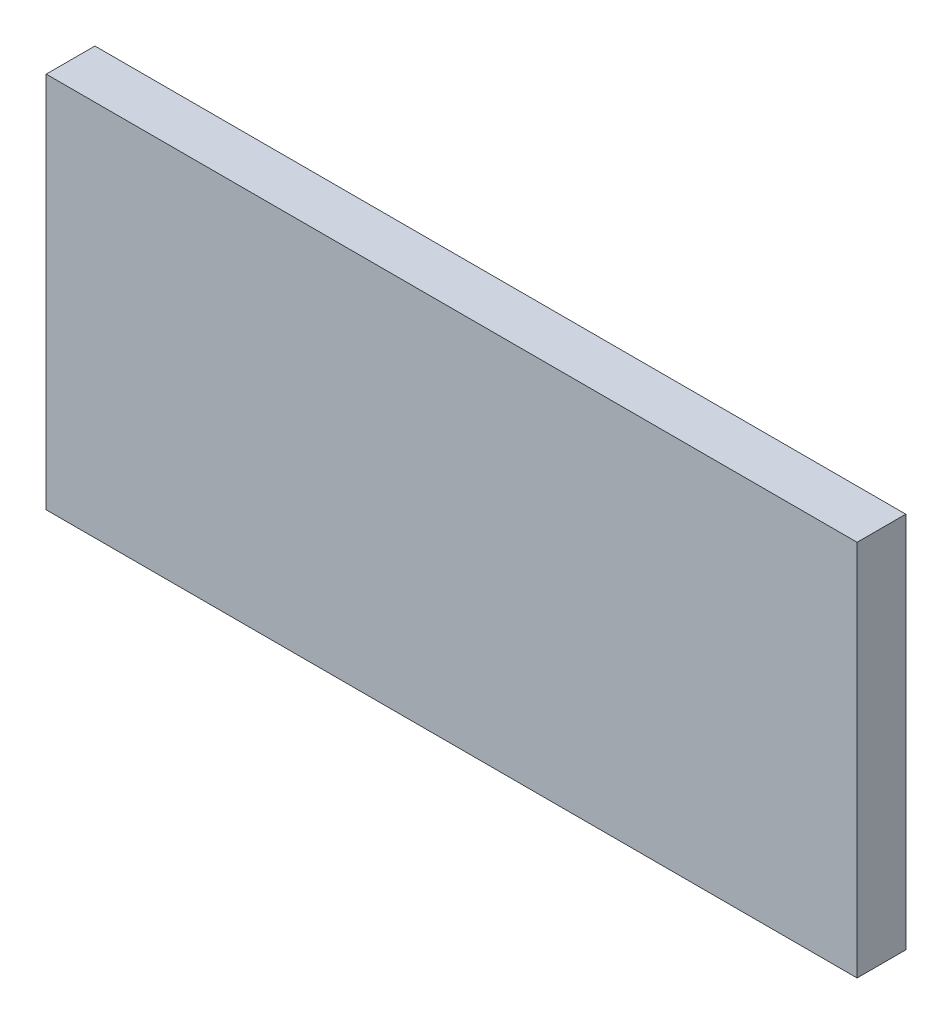
ISO-10303-21;
HEADER;
FILE_DESCRIPTION(('STEP AP214'),'2;1');
FILE_NAME('part.step','',(''),(''),'','','');
FILE_SCHEMA(('AUTOMOTIVE_DESIGN { 1 0 10303 214 1 1 1 1 }'));
ENDSEC;
DATA;
#1=APPLICATION_CONTEXT('core data for automotive mechanical design processes');
#2=APPLICATION_PROTOCOL_DEFINITION('international standard','automotive_design',2000,#1);
#3=PRODUCT_CONTEXT('',#1,'mechanical');
#4=PRODUCT('Part','Part','',(#3));
#5=PRODUCT_RELATED_PRODUCT_CATEGORY('part','',(#4));
#6=PRODUCT_DEFINITION_FORMATION('','',#4);
#7=PRODUCT_DEFINITION_CONTEXT('part definition',#1,'design');
#8=PRODUCT_DEFINITION('design','',#6,#7);
#9=PRODUCT_DEFINITION_SHAPE('','',#8);
#10=(LENGTH_UNIT() NAMED_UNIT(*) SI_UNIT(.MILLI.,.METRE.));
#11=(NAMED_UNIT(*) PLANE_ANGLE_UNIT() SI_UNIT($,.RADIAN.));
#12=(NAMED_UNIT(*) SI_UNIT($,.STERADIAN.) SOLID_ANGLE_UNIT());
#13=UNCERTAINTY_MEASURE_WITH_UNIT(LENGTH_MEASURE(1.E-05),#10,'distance_accuracy_value','');
#14=(GEOMETRIC_REPRESENTATION_CONTEXT(3) GLOBAL_UNCERTAINTY_ASSIGNED_CONTEXT((#13)) GLOBAL_UNIT_ASSIGNED_CONTEXT((#10,
#11,#12)) REPRESENTATION_CONTEXT('',''));
#15=CARTESIAN_POINT('',(0.,0.,0.));
#16=DIRECTION('',(0.,0.,1.));
#17=DIRECTION('',(1.,0.,0.));
#18=AXIS2_PLACEMENT_3D('',#15,#16,#17);
#19=CARTESIAN_POINT('',(21.125,-3.875,4.5));
#20=DIRECTION('',(0.,0.,-1.));
#21=DIRECTION('',(0.,-1.,0.));
#22=AXIS2_PLACEMENT_3D('',#19,#20,#21);
#23=PLANE('',#22);
#24=DIRECTION('',(1.,0.,0.));
#25=VECTOR('',#24,1.);
#26=CARTESIAN_POINT('',(12.7980970388563,0.,4.5));
#27=LINE('',#26,#25);
#28=CARTESIAN_POINT('',(12.7980970388563,0.,4.5));
#29=VERTEX_POINT('',#28);
#30=CARTESIAN_POINT('',(29.4519029611437,0.,4.5));
#31=VERTEX_POINT('',#30);
#32=EDGE_CURVE('E20',#29,#31,#27,.T.);
#33=ORIENTED_EDGE('',*,*,#32,.F.);
#34=DIRECTION('',(0.,1.,0.));
#35=VECTOR('',#34,1.);
#36=CARTESIAN_POINT('',(12.7980970388563,-7.75,4.5));
#37=LINE('',#36,#35);
#38=CARTESIAN_POINT('',(12.7980970388563,-7.75,4.5));
#39=VERTEX_POINT('',#38);
#40=EDGE_CURVE('E83',#39,#29,#37,.T.);
#41=ORIENTED_EDGE('',*,*,#40,.F.);
#42=DIRECTION('',(-1.,0.,0.));
#43=VECTOR('',#42,1.);
#44=CARTESIAN_POINT('',(29.4519029611437,-7.75,4.5));
#45=LINE('',#44,#43);
#46=CARTESIAN_POINT('',(29.4519029611437,-7.75,4.5));
#47=VERTEX_POINT('',#46);
#48=EDGE_CURVE('E100',#47,#39,#45,.T.);
#49=ORIENTED_EDGE('',*,*,#48,.F.);
#50=DIRECTION('',(0.,-1.,0.));
#51=VECTOR('',#50,1.);
#52=CARTESIAN_POINT('',(29.4519029611437,0.,4.5));
#53=LINE('',#52,#51);
#54=EDGE_CURVE('E97',#31,#47,#53,.T.);
#55=ORIENTED_EDGE('',*,*,#54,.F.);
#56=EDGE_LOOP('',(#33,#41,#49,#55));
#57=FACE_BOUND('',#56,.T.);
#58=ADVANCED_FACE('F17',(#57),#23,.F.);
#59=CARTESIAN_POINT('',(21.125,-3.875,3.5));
#60=DIRECTION('',(0.,0.,-1.));
#61=DIRECTION('',(0.,-1.,0.));
#62=AXIS2_PLACEMENT_3D('',#59,#60,#61);
#63=PLANE('',#62);
#64=DIRECTION('',(1.,0.,0.));
#65=VECTOR('',#64,1.);
#66=CARTESIAN_POINT('',(12.7980970388563,0.,3.5));
#67=LINE('',#66,#65);
#68=CARTESIAN_POINT('',(12.7980970388563,0.,3.5));
#69=VERTEX_POINT('',#68);
#70=CARTESIAN_POINT('',(29.4519029611437,0.,3.5));
#71=VERTEX_POINT('',#70);
#72=EDGE_CURVE('E11',#69,#71,#67,.T.);
#73=ORIENTED_EDGE('',*,*,#72,.T.);
#74=DIRECTION('',(0.,-1.,0.));
#75=VECTOR('',#74,1.);
#76=CARTESIAN_POINT('',(29.4519029611437,0.,3.5));
#77=LINE('',#76,#75);
#78=CARTESIAN_POINT('',(29.4519029611437,-7.75,3.5));
#79=VERTEX_POINT('',#78);
#80=EDGE_CURVE('E93',#71,#79,#77,.T.);
#81=ORIENTED_EDGE('',*,*,#80,.T.);
#82=DIRECTION('',(-1.,0.,0.));
#83=VECTOR('',#82,1.);
#84=CARTESIAN_POINT('',(29.4519029611437,-7.75,3.5));
#85=LINE('',#84,#83);
#86=CARTESIAN_POINT('',(12.7980970388563,-7.75,3.5));
#87=VERTEX_POINT('',#86);
#88=EDGE_CURVE('E57',#79,#87,#85,.T.);
#89=ORIENTED_EDGE('',*,*,#88,.T.);
#90=DIRECTION('',(0.,1.,0.));
#91=VECTOR('',#90,1.);
#92=CARTESIAN_POINT('',(12.7980970388563,-7.75,3.5));
#93=LINE('',#92,#91);
#94=EDGE_CURVE('E74',#87,#69,#93,.T.);
#95=ORIENTED_EDGE('',*,*,#94,.T.);
#96=EDGE_LOOP('',(#73,#81,#89,#95));
#97=FACE_BOUND('',#96,.T.);
#98=ADVANCED_FACE('F75',(#97),#63,.T.);
#99=CARTESIAN_POINT('',(12.7980970388563,0.,4.5));
#100=DIRECTION('',(0.,1.,0.));
#101=DIRECTION('',(1.,0.,0.));
#102=AXIS2_PLACEMENT_3D('',#99,#100,#101);
#103=PLANE('',#102);
#104=ORIENTED_EDGE('',*,*,#32,.T.);
#105=DIRECTION('',(0.,0.,-1.));
#106=VECTOR('',#105,1.);
#107=CARTESIAN_POINT('',(29.4519029611437,0.,4.5));
#108=LINE('',#107,#106);
#109=EDGE_CURVE('E71',#31,#71,#108,.T.);
#110=ORIENTED_EDGE('',*,*,#109,.T.);
#111=ORIENTED_EDGE('',*,*,#72,.F.);
#112=DIRECTION('',(0.,0.,-1.));
#113=VECTOR('',#112,1.);
#114=CARTESIAN_POINT('',(12.7980970388563,0.,4.5));
#115=LINE('',#114,#113);
#116=EDGE_CURVE('E68',#29,#69,#115,.T.);
#117=ORIENTED_EDGE('',*,*,#116,.F.);
#118=EDGE_LOOP('',(#104,#110,#111,#117));
#119=FACE_BOUND('',#118,.T.);
#120=ADVANCED_FACE('F66',(#119),#103,.T.);
#121=CARTESIAN_POINT('',(29.4519029611437,0.,4.5));
#122=DIRECTION('',(1.,0.,0.));
#123=DIRECTION('',(0.,1.,0.));
#124=AXIS2_PLACEMENT_3D('',#121,#122,#123);
#125=PLANE('',#124);
#126=ORIENTED_EDGE('',*,*,#54,.T.);
#127=DIRECTION('',(0.,0.,-1.));
#128=VECTOR('',#127,1.);
#129=CARTESIAN_POINT('',(29.4519029611437,-7.75,4.5));
#130=LINE('',#129,#128);
#131=EDGE_CURVE('E102',#47,#79,#130,.T.);
#132=ORIENTED_EDGE('',*,*,#131,.T.);
#133=ORIENTED_EDGE('',*,*,#80,.F.);
#134=ORIENTED_EDGE('',*,*,#109,.F.);
#135=EDGE_LOOP('',(#126,#132,#133,#134));
#136=FACE_BOUND('',#135,.T.);
#137=ADVANCED_FACE('F114',(#136),#125,.T.);
#138=CARTESIAN_POINT('',(29.4519029611437,-7.75,4.5));
#139=DIRECTION('',(0.,-1.,0.));
#140=DIRECTION('',(0.,0.,-1.));
#141=AXIS2_PLACEMENT_3D('',#138,#139,#140);
#142=PLANE('',#141);
#143=ORIENTED_EDGE('',*,*,#48,.T.);
#144=DIRECTION('',(0.,0.,-1.));
#145=VECTOR('',#144,1.);
#146=CARTESIAN_POINT('',(12.7980970388563,-7.75,4.5));
#147=LINE('',#146,#145);
#148=EDGE_CURVE('E79',#39,#87,#147,.T.);
#149=ORIENTED_EDGE('',*,*,#148,.T.);
#150=ORIENTED_EDGE('',*,*,#88,.F.);
#151=ORIENTED_EDGE('',*,*,#131,.F.);
#152=EDGE_LOOP('',(#143,#149,#150,#151));
#153=FACE_BOUND('',#152,.T.);
#154=ADVANCED_FACE('F119',(#153),#142,.T.);
#155=CARTESIAN_POINT('',(12.7980970388563,-7.75,4.5));
#156=DIRECTION('',(-1.,0.,0.));
#157=DIRECTION('',(0.,0.,1.));
#158=AXIS2_PLACEMENT_3D('',#155,#156,#157);
#159=PLANE('',#158);
#160=ORIENTED_EDGE('',*,*,#40,.T.);
#161=ORIENTED_EDGE('',*,*,#116,.T.);
#162=ORIENTED_EDGE('',*,*,#94,.F.);
#163=ORIENTED_EDGE('',*,*,#148,.F.);
#164=EDGE_LOOP('',(#160,#161,#162,#163));
#165=FACE_BOUND('',#164,.T.);
#166=ADVANCED_FACE('F81',(#165),#159,.T.);
#167=CLOSED_SHELL('',(#58,#98,#120,#137,#154,#166));
#168=MANIFOLD_SOLID_BREP('B1',#167);
#169=ADVANCED_BREP_SHAPE_REPRESENTATION('',(#18,#168),#14);
#170=SHAPE_DEFINITION_REPRESENTATION(#9,#169);
ENDSEC;
END-ISO-10303-21;
